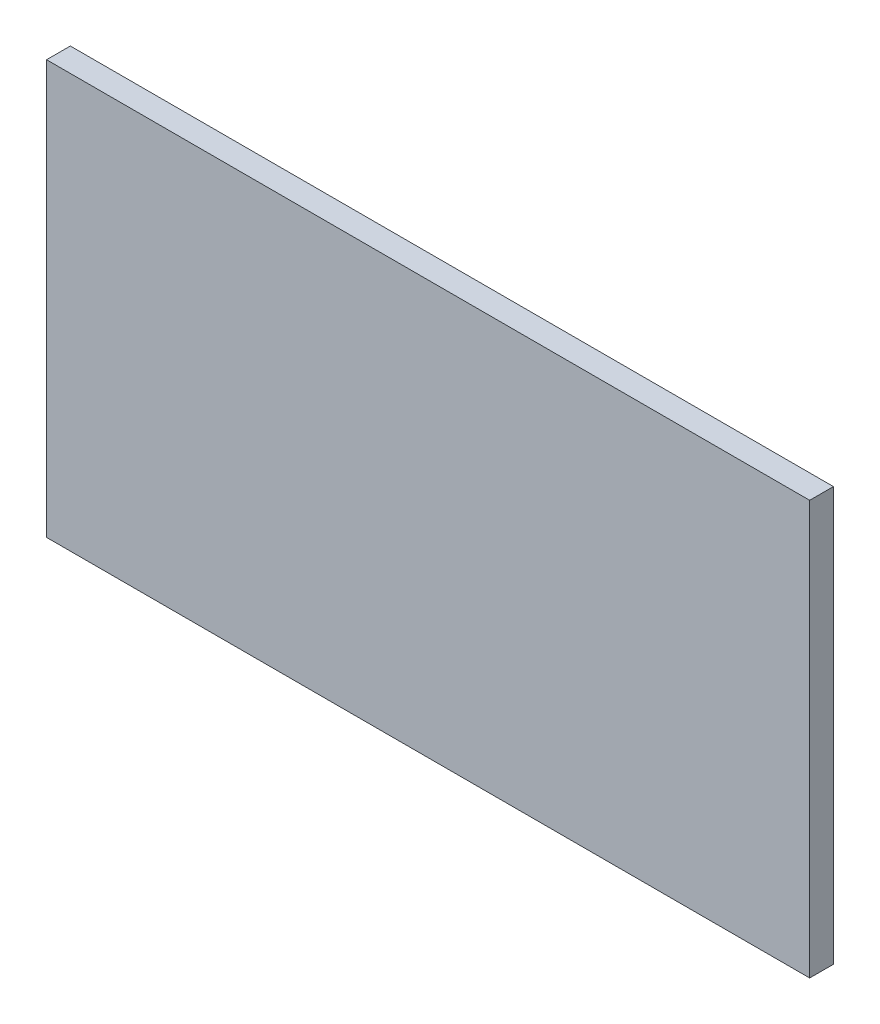
ISO-10303-21;
HEADER;
FILE_DESCRIPTION(('STEP AP214'),'2;1');
FILE_NAME('part.step','',(''),(''),'','','');
FILE_SCHEMA(('AUTOMOTIVE_DESIGN { 1 0 10303 214 1 1 1 1 }'));
ENDSEC;
DATA;
#1=APPLICATION_CONTEXT('core data for automotive mechanical design processes');
#2=APPLICATION_PROTOCOL_DEFINITION('international standard','automotive_design',2000,#1);
#3=PRODUCT_CONTEXT('',#1,'mechanical');
#4=PRODUCT('Part','Part','',(#3));
#5=PRODUCT_RELATED_PRODUCT_CATEGORY('part','',(#4));
#6=PRODUCT_DEFINITION_FORMATION('','',#4);
#7=PRODUCT_DEFINITION_CONTEXT('part definition',#1,'design');
#8=PRODUCT_DEFINITION('design','',#6,#7);
#9=PRODUCT_DEFINITION_SHAPE('','',#8);
#10=(LENGTH_UNIT() NAMED_UNIT(*) SI_UNIT(.MILLI.,.METRE.));
#11=(NAMED_UNIT(*) PLANE_ANGLE_UNIT() SI_UNIT($,.RADIAN.));
#12=(NAMED_UNIT(*) SI_UNIT($,.STERADIAN.) SOLID_ANGLE_UNIT());
#13=UNCERTAINTY_MEASURE_WITH_UNIT(LENGTH_MEASURE(1.E-05),#10,'distance_accuracy_value','');
#14=(GEOMETRIC_REPRESENTATION_CONTEXT(3) GLOBAL_UNCERTAINTY_ASSIGNED_CONTEXT((#13)) GLOBAL_UNIT_ASSIGNED_CONTEXT((#10,
#11,#12)) REPRESENTATION_CONTEXT('',''));
#15=CARTESIAN_POINT('',(0.,0.,0.));
#16=DIRECTION('',(0.,0.,1.));
#17=DIRECTION('',(1.,0.,0.));
#18=AXIS2_PLACEMENT_3D('',#15,#16,#17);
#19=CARTESIAN_POINT('',(-21.5460728560663,26.9410499139415,2.54));
#20=DIRECTION('',(1.,0.,0.));
#21=DIRECTION('',(0.,0.,-1.));
#22=AXIS2_PLACEMENT_3D('',#19,#20,#21);
#23=PLANE('',#22);
#24=DIRECTION('',(0.,-1.,0.));
#25=VECTOR('',#24,1.);
#26=CARTESIAN_POINT('',(-21.5460728560663,26.9410499139415,0.));
#27=LINE('',#26,#25);
#28=CARTESIAN_POINT('',(-21.5460728560663,26.9410499139415,0.));
#29=VERTEX_POINT('',#28);
#30=CARTESIAN_POINT('',(-21.5460728560663,-17.2794320137694,0.));
#31=VERTEX_POINT('',#30);
#32=EDGE_CURVE('E102',#29,#31,#27,.T.);
#33=ORIENTED_EDGE('',*,*,#32,.T.);
#34=DIRECTION('',(0.,0.,-1.));
#35=VECTOR('',#34,1.);
#36=CARTESIAN_POINT('',(-21.5460728560663,-17.2794320137694,2.54));
#37=LINE('',#36,#35);
#38=CARTESIAN_POINT('',(-21.5460728560663,-17.2794320137694,2.54));
#39=VERTEX_POINT('',#38);
#40=EDGE_CURVE('E11',#39,#31,#37,.T.);
#41=ORIENTED_EDGE('',*,*,#40,.F.);
#42=DIRECTION('',(0.,-1.,0.));
#43=VECTOR('',#42,1.);
#44=CARTESIAN_POINT('',(-21.5460728560663,26.9410499139415,2.54));
#45=LINE('',#44,#43);
#46=CARTESIAN_POINT('',(-21.5460728560663,26.9410499139415,2.54));
#47=VERTEX_POINT('',#46);
#48=EDGE_CURVE('E90',#47,#39,#45,.T.);
#49=ORIENTED_EDGE('',*,*,#48,.F.);
#50=DIRECTION('',(0.,0.,-1.));
#51=VECTOR('',#50,1.);
#52=CARTESIAN_POINT('',(-21.5460728560663,26.9410499139415,2.54));
#53=LINE('',#52,#51);
#54=EDGE_CURVE('E98',#47,#29,#53,.T.);
#55=ORIENTED_EDGE('',*,*,#54,.T.);
#56=EDGE_LOOP('',(#33,#41,#49,#55));
#57=FACE_BOUND('',#56,.T.);
#58=ADVANCED_FACE('F39',(#57),#23,.F.);
#59=CARTESIAN_POINT('',(-21.5460728560663,-17.2794320137694,2.54));
#60=DIRECTION('',(0.,1.,0.));
#61=DIRECTION('',(0.,0.,1.));
#62=AXIS2_PLACEMENT_3D('',#59,#60,#61);
#63=PLANE('',#62);
#64=DIRECTION('',(1.,0.,0.));
#65=VECTOR('',#64,1.);
#66=CARTESIAN_POINT('',(-21.5460728560663,-17.2794320137694,0.));
#67=LINE('',#66,#65);
#68=CARTESIAN_POINT('',(60.0202782626945,-17.2794320137694,0.));
#69=VERTEX_POINT('',#68);
#70=EDGE_CURVE('E94',#31,#69,#67,.T.);
#71=ORIENTED_EDGE('',*,*,#70,.T.);
#72=DIRECTION('',(0.,0.,-1.));
#73=VECTOR('',#72,1.);
#74=CARTESIAN_POINT('',(60.0202782626945,-17.2794320137694,2.54));
#75=LINE('',#74,#73);
#76=CARTESIAN_POINT('',(60.0202782626945,-17.2794320137694,2.54));
#77=VERTEX_POINT('',#76);
#78=EDGE_CURVE('E47',#77,#69,#75,.T.);
#79=ORIENTED_EDGE('',*,*,#78,.F.);
#80=DIRECTION('',(1.,0.,0.));
#81=VECTOR('',#80,1.);
#82=CARTESIAN_POINT('',(-21.5460728560663,-17.2794320137694,2.54));
#83=LINE('',#82,#81);
#84=EDGE_CURVE('E85',#39,#77,#83,.T.);
#85=ORIENTED_EDGE('',*,*,#84,.F.);
#86=ORIENTED_EDGE('',*,*,#40,.T.);
#87=EDGE_LOOP('',(#71,#79,#85,#86));
#88=FACE_BOUND('',#87,.T.);
#89=ADVANCED_FACE('F93',(#88),#63,.F.);
#90=CARTESIAN_POINT('',(60.0202782626945,26.9410499139415,2.54));
#91=DIRECTION('',(-1.,0.,0.));
#92=DIRECTION('',(0.,0.,1.));
#93=AXIS2_PLACEMENT_3D('',#90,#91,#92);
#94=PLANE('',#93);
#95=DIRECTION('',(0.,1.,0.));
#96=VECTOR('',#95,1.);
#97=CARTESIAN_POINT('',(60.0202782626945,26.9410499139415,0.));
#98=LINE('',#97,#96);
#99=CARTESIAN_POINT('',(60.0202782626945,26.9410499139415,0.));
#100=VERTEX_POINT('',#99);
#101=EDGE_CURVE('E72',#69,#100,#98,.T.);
#102=ORIENTED_EDGE('',*,*,#101,.T.);
#103=DIRECTION('',(0.,0.,-1.));
#104=VECTOR('',#103,1.);
#105=CARTESIAN_POINT('',(60.0202782626945,26.9410499139415,2.54));
#106=LINE('',#105,#104);
#107=CARTESIAN_POINT('',(60.0202782626945,26.9410499139415,2.54));
#108=VERTEX_POINT('',#107);
#109=EDGE_CURVE('E95',#108,#100,#106,.T.);
#110=ORIENTED_EDGE('',*,*,#109,.F.);
#111=DIRECTION('',(0.,1.,0.));
#112=VECTOR('',#111,1.);
#113=CARTESIAN_POINT('',(60.0202782626945,26.9410499139415,2.54));
#114=LINE('',#113,#112);
#115=EDGE_CURVE('E88',#77,#108,#114,.T.);
#116=ORIENTED_EDGE('',*,*,#115,.F.);
#117=ORIENTED_EDGE('',*,*,#78,.T.);
#118=EDGE_LOOP('',(#102,#110,#116,#117));
#119=FACE_BOUND('',#118,.T.);
#120=ADVANCED_FACE('F96',(#119),#94,.F.);
#121=CARTESIAN_POINT('',(-21.5460728560663,26.9410499139415,2.54));
#122=DIRECTION('',(0.,-1.,0.));
#123=DIRECTION('',(0.,0.,-1.));
#124=AXIS2_PLACEMENT_3D('',#121,#122,#123);
#125=PLANE('',#124);
#126=DIRECTION('',(-1.,0.,0.));
#127=VECTOR('',#126,1.);
#128=CARTESIAN_POINT('',(-21.5460728560663,26.9410499139415,0.));
#129=LINE('',#128,#127);
#130=EDGE_CURVE('E78',#100,#29,#129,.T.);
#131=ORIENTED_EDGE('',*,*,#130,.T.);
#132=ORIENTED_EDGE('',*,*,#54,.F.);
#133=DIRECTION('',(-1.,0.,0.));
#134=VECTOR('',#133,1.);
#135=CARTESIAN_POINT('',(-21.5460728560663,26.9410499139415,2.54));
#136=LINE('',#135,#134);
#137=EDGE_CURVE('E55',#108,#47,#136,.T.);
#138=ORIENTED_EDGE('',*,*,#137,.F.);
#139=ORIENTED_EDGE('',*,*,#109,.T.);
#140=EDGE_LOOP('',(#131,#132,#138,#139));
#141=FACE_BOUND('',#140,.T.);
#142=ADVANCED_FACE('F109',(#141),#125,.F.);
#143=CARTESIAN_POINT('',(0.,0.,2.54));
#144=DIRECTION('',(0.,0.,1.));
#145=DIRECTION('',(1.,0.,0.));
#146=AXIS2_PLACEMENT_3D('',#143,#144,#145);
#147=PLANE('',#146);
#148=ORIENTED_EDGE('',*,*,#48,.T.);
#149=ORIENTED_EDGE('',*,*,#84,.T.);
#150=ORIENTED_EDGE('',*,*,#115,.T.);
#151=ORIENTED_EDGE('',*,*,#137,.T.);
#152=EDGE_LOOP('',(#148,#149,#150,#151));
#153=FACE_BOUND('',#152,.T.);
#154=ADVANCED_FACE('F86',(#153),#147,.T.);
#155=CARTESIAN_POINT('',(0.,0.,0.));
#156=DIRECTION('',(0.,0.,1.));
#157=DIRECTION('',(1.,0.,0.));
#158=AXIS2_PLACEMENT_3D('',#155,#156,#157);
#159=PLANE('',#158);
#160=ORIENTED_EDGE('',*,*,#32,.F.);
#161=ORIENTED_EDGE('',*,*,#130,.F.);
#162=ORIENTED_EDGE('',*,*,#101,.F.);
#163=ORIENTED_EDGE('',*,*,#70,.F.);
#164=EDGE_LOOP('',(#160,#161,#162,#163));
#165=FACE_BOUND('',#164,.T.);
#166=ADVANCED_FACE('F112',(#165),#159,.F.);
#167=CLOSED_SHELL('',(#58,#89,#120,#142,#154,#166));
#168=MANIFOLD_SOLID_BREP('B2',#167);
#169=ADVANCED_BREP_SHAPE_REPRESENTATION('',(#18,#168),#14);
#170=SHAPE_DEFINITION_REPRESENTATION(#9,#169);
ENDSEC;
END-ISO-10303-21;
